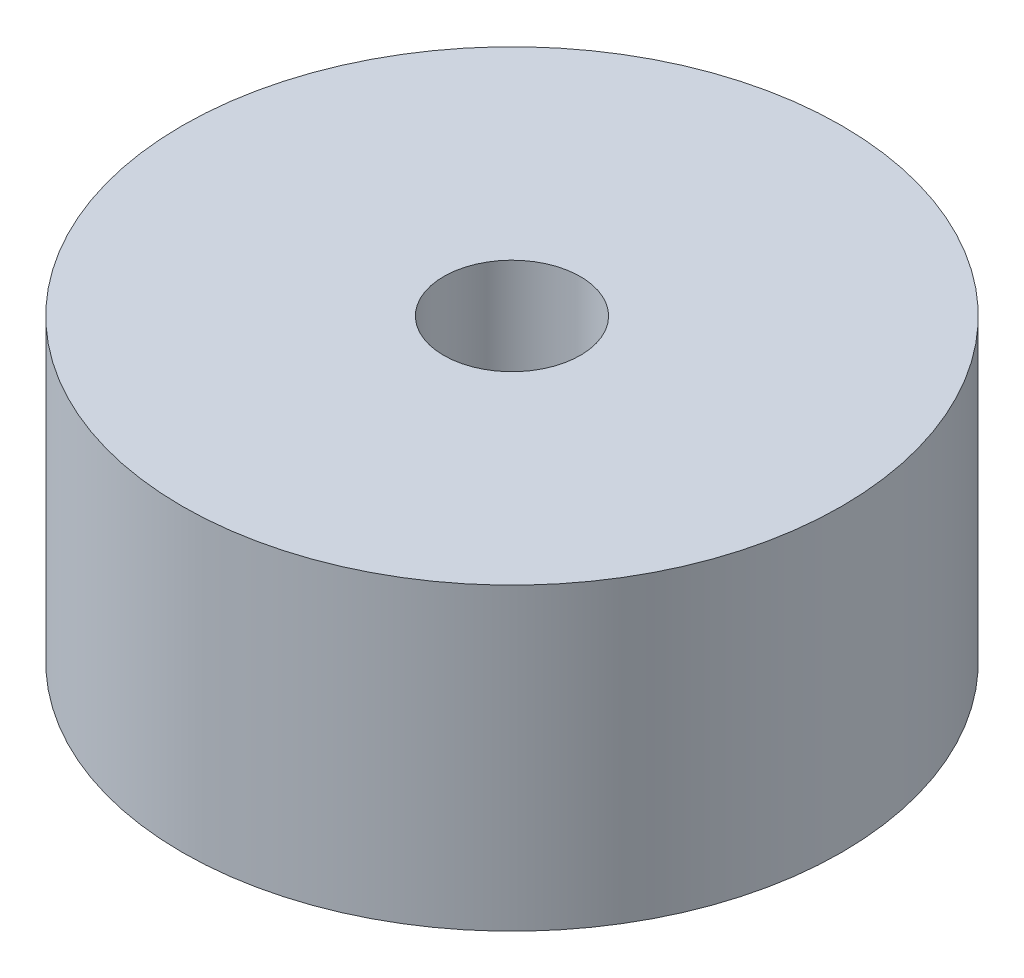
ISO-10303-21;
HEADER;
FILE_DESCRIPTION(('STEP AP214'),'2;1');
FILE_NAME('part.step','',(''),(''),'','','');
FILE_SCHEMA(('AUTOMOTIVE_DESIGN { 1 0 10303 214 1 1 1 1 }'));
ENDSEC;
DATA;
#1=APPLICATION_CONTEXT('core data for automotive mechanical design processes');
#2=APPLICATION_PROTOCOL_DEFINITION('international standard','automotive_design',2000,#1);
#3=PRODUCT_CONTEXT('',#1,'mechanical');
#4=PRODUCT('Part','Part','',(#3));
#5=PRODUCT_RELATED_PRODUCT_CATEGORY('part','',(#4));
#6=PRODUCT_DEFINITION_FORMATION('','',#4);
#7=PRODUCT_DEFINITION_CONTEXT('part definition',#1,'design');
#8=PRODUCT_DEFINITION('design','',#6,#7);
#9=PRODUCT_DEFINITION_SHAPE('','',#8);
#10=(LENGTH_UNIT() NAMED_UNIT(*) SI_UNIT(.MILLI.,.METRE.));
#11=(NAMED_UNIT(*) PLANE_ANGLE_UNIT() SI_UNIT($,.RADIAN.));
#12=(NAMED_UNIT(*) SI_UNIT($,.STERADIAN.) SOLID_ANGLE_UNIT());
#13=UNCERTAINTY_MEASURE_WITH_UNIT(LENGTH_MEASURE(1.E-05),#10,'distance_accuracy_value','');
#14=(GEOMETRIC_REPRESENTATION_CONTEXT(3) GLOBAL_UNCERTAINTY_ASSIGNED_CONTEXT((#13)) GLOBAL_UNIT_ASSIGNED_CONTEXT((#10,
#11,#12)) REPRESENTATION_CONTEXT('',''));
#15=CARTESIAN_POINT('',(0.,0.,0.));
#16=DIRECTION('',(0.,0.,1.));
#17=DIRECTION('',(1.,0.,0.));
#18=AXIS2_PLACEMENT_3D('',#15,#16,#17);
#19=CARTESIAN_POINT('',(0.,5.,0.));
#20=DIRECTION('',(0.,1.,0.));
#21=DIRECTION('',(0.,0.,1.));
#22=AXIS2_PLACEMENT_3D('',#19,#20,#21);
#23=PLANE('',#22);
#24=CARTESIAN_POINT('',(0.,5.,0.));
#25=DIRECTION('',(0.,1.,0.));
#26=DIRECTION('',(0.,0.,1.));
#27=AXIS2_PLACEMENT_3D('',#24,#25,#26);
#28=CIRCLE('',#27,5.5);
#29=CARTESIAN_POINT('',(0.,5.,5.5));
#30=VERTEX_POINT('',#29);
#31=EDGE_CURVE('E10',#30,#30,#28,.T.);
#32=ORIENTED_EDGE('',*,*,#31,.T.);
#33=EDGE_LOOP('',(#32));
#34=FACE_BOUND('',#33,.T.);
#35=CARTESIAN_POINT('',(0.,5.,0.));
#36=DIRECTION('',(0.,1.,0.));
#37=DIRECTION('',(0.,0.,1.));
#38=AXIS2_PLACEMENT_3D('',#35,#36,#37);
#39=CIRCLE('',#38,1.14);
#40=CARTESIAN_POINT('',(0.,5.,1.14));
#41=VERTEX_POINT('',#40);
#42=EDGE_CURVE('E42',#41,#41,#39,.T.);
#43=ORIENTED_EDGE('',*,*,#42,.F.);
#44=EDGE_LOOP('',(#43));
#45=FACE_BOUND('',#44,.T.);
#46=ADVANCED_FACE('F31',(#34,#45),#23,.T.);
#47=CARTESIAN_POINT('',(0.,0.,0.));
#48=DIRECTION('',(0.,1.,0.));
#49=DIRECTION('',(0.,0.,1.));
#50=AXIS2_PLACEMENT_3D('',#47,#48,#49);
#51=PLANE('',#50);
#52=CARTESIAN_POINT('',(0.,0.,0.));
#53=DIRECTION('',(0.,1.,0.));
#54=DIRECTION('',(0.,0.,1.));
#55=AXIS2_PLACEMENT_3D('',#52,#53,#54);
#56=CIRCLE('',#55,5.5);
#57=CARTESIAN_POINT('',(0.,0.,5.5));
#58=VERTEX_POINT('',#57);
#59=EDGE_CURVE('E35',#58,#58,#56,.T.);
#60=ORIENTED_EDGE('',*,*,#59,.F.);
#61=EDGE_LOOP('',(#60));
#62=FACE_BOUND('',#61,.T.);
#63=CARTESIAN_POINT('',(0.,0.,0.));
#64=DIRECTION('',(0.,1.,0.));
#65=DIRECTION('',(0.,0.,1.));
#66=AXIS2_PLACEMENT_3D('',#63,#64,#65);
#67=CIRCLE('',#66,1.14);
#68=CARTESIAN_POINT('',(0.,0.,1.14));
#69=VERTEX_POINT('',#68);
#70=EDGE_CURVE('E44',#69,#69,#67,.T.);
#71=ORIENTED_EDGE('',*,*,#70,.T.);
#72=EDGE_LOOP('',(#71));
#73=FACE_BOUND('',#72,.T.);
#74=ADVANCED_FACE('F54',(#62,#73),#51,.F.);
#75=CARTESIAN_POINT('',(0.,5.,0.));
#76=DIRECTION('',(0.,-1.,0.));
#77=DIRECTION('',(0.,0.,-1.));
#78=AXIS2_PLACEMENT_3D('',#75,#76,#77);
#79=CYLINDRICAL_SURFACE('',#78,5.5);
#80=ORIENTED_EDGE('',*,*,#31,.F.);
#81=EDGE_LOOP('',(#80));
#82=FACE_BOUND('',#81,.T.);
#83=ORIENTED_EDGE('',*,*,#59,.T.);
#84=EDGE_LOOP('',(#83));
#85=FACE_BOUND('',#84,.T.);
#86=ADVANCED_FACE('F33',(#82,#85),#79,.T.);
#87=CARTESIAN_POINT('',(0.,5.,0.));
#88=DIRECTION('',(0.,-1.,0.));
#89=DIRECTION('',(0.,0.,-1.));
#90=AXIS2_PLACEMENT_3D('',#87,#88,#89);
#91=CYLINDRICAL_SURFACE('',#90,1.14);
#92=ORIENTED_EDGE('',*,*,#42,.T.);
#93=EDGE_LOOP('',(#92));
#94=FACE_BOUND('',#93,.T.);
#95=ORIENTED_EDGE('',*,*,#70,.F.);
#96=EDGE_LOOP('',(#95));
#97=FACE_BOUND('',#96,.T.);
#98=ADVANCED_FACE('F50',(#94,#97),#91,.F.);
#99=CLOSED_SHELL('',(#46,#74,#86,#98));
#100=MANIFOLD_SOLID_BREP('B2',#99);
#101=ADVANCED_BREP_SHAPE_REPRESENTATION('',(#18,#100),#14);
#102=SHAPE_DEFINITION_REPRESENTATION(#9,#101);
ENDSEC;
END-ISO-10303-21;
